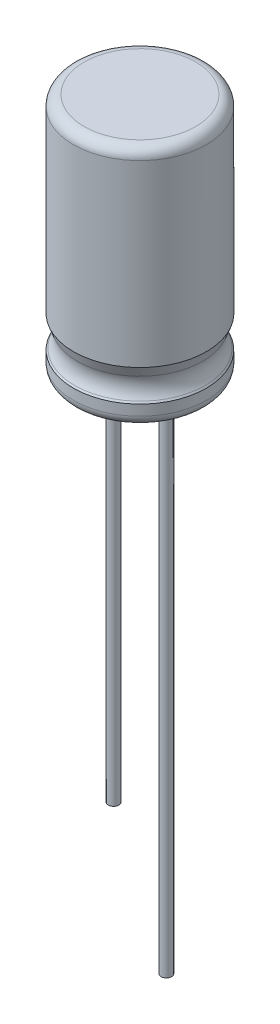
ISO-10303-21;
HEADER;
FILE_DESCRIPTION(('STEP AP214'),'2;1');
FILE_NAME('part.step','',(''),(''),'','','');
FILE_SCHEMA(('AUTOMOTIVE_DESIGN { 1 0 10303 214 1 1 1 1 }'));
ENDSEC;
DATA;
#1=APPLICATION_CONTEXT('core data for automotive mechanical design processes');
#2=APPLICATION_PROTOCOL_DEFINITION('international standard','automotive_design',2000,#1);
#3=PRODUCT_CONTEXT('',#1,'mechanical');
#4=PRODUCT('Part','Part','',(#3));
#5=PRODUCT_RELATED_PRODUCT_CATEGORY('part','',(#4));
#6=PRODUCT_DEFINITION_FORMATION('','',#4);
#7=PRODUCT_DEFINITION_CONTEXT('part definition',#1,'design');
#8=PRODUCT_DEFINITION('design','',#6,#7);
#9=PRODUCT_DEFINITION_SHAPE('','',#8);
#10=(LENGTH_UNIT() NAMED_UNIT(*) SI_UNIT(.MILLI.,.METRE.));
#11=(NAMED_UNIT(*) PLANE_ANGLE_UNIT() SI_UNIT($,.RADIAN.));
#12=(NAMED_UNIT(*) SI_UNIT($,.STERADIAN.) SOLID_ANGLE_UNIT());
#13=UNCERTAINTY_MEASURE_WITH_UNIT(LENGTH_MEASURE(1.E-05),#10,'distance_accuracy_value','');
#14=(GEOMETRIC_REPRESENTATION_CONTEXT(3) GLOBAL_UNCERTAINTY_ASSIGNED_CONTEXT((#13)) GLOBAL_UNIT_ASSIGNED_CONTEXT((#10,
#11,#12)) REPRESENTATION_CONTEXT('',''));
#15=CARTESIAN_POINT('',(0.,0.,0.));
#16=DIRECTION('',(0.,0.,1.));
#17=DIRECTION('',(1.,0.,0.));
#18=AXIS2_PLACEMENT_3D('',#15,#16,#17);
#19=CARTESIAN_POINT('',(-1.25,0.,0.));
#20=DIRECTION('',(0.,-1.,0.));
#21=DIRECTION('',(0.,0.,-1.));
#22=AXIS2_PLACEMENT_3D('',#19,#20,#21);
#23=CYLINDRICAL_SURFACE('',#22,0.25);
#24=CARTESIAN_POINT('',(-1.25,0.,0.));
#25=DIRECTION('',(0.,1.,0.));
#26=DIRECTION('',(0.,0.,1.));
#27=AXIS2_PLACEMENT_3D('',#24,#25,#26);
#28=CIRCLE('',#27,0.25);
#29=CARTESIAN_POINT('',(-1.25,0.,0.25));
#30=VERTEX_POINT('',#29);
#31=EDGE_CURVE('E55',#30,#30,#28,.T.);
#32=ORIENTED_EDGE('',*,*,#31,.F.);
#33=EDGE_LOOP('',(#32));
#34=FACE_BOUND('',#33,.T.);
#35=CARTESIAN_POINT('',(-1.25,-18.2,0.));
#36=DIRECTION('',(0.,1.,0.));
#37=DIRECTION('',(0.,0.,1.));
#38=AXIS2_PLACEMENT_3D('',#35,#36,#37);
#39=CIRCLE('',#38,0.25);
#40=CARTESIAN_POINT('',(-1.25,-18.2,0.25));
#41=VERTEX_POINT('',#40);
#42=EDGE_CURVE('E11',#41,#41,#39,.T.);
#43=ORIENTED_EDGE('',*,*,#42,.T.);
#44=EDGE_LOOP('',(#43));
#45=FACE_BOUND('',#44,.T.);
#46=ADVANCED_FACE('F49',(#34,#45),#23,.T.);
#47=CARTESIAN_POINT('',(-1.25,0.,0.));
#48=DIRECTION('',(0.,1.,0.));
#49=DIRECTION('',(0.,0.,1.));
#50=AXIS2_PLACEMENT_3D('',#47,#48,#49);
#51=PLANE('',#50);
#52=ORIENTED_EDGE('',*,*,#31,.T.);
#53=EDGE_LOOP('',(#52));
#54=FACE_BOUND('',#53,.T.);
#55=ADVANCED_FACE('F61',(#54),#51,.T.);
#56=CARTESIAN_POINT('',(-1.5,-18.2,5.));
#57=DIRECTION('',(0.,1.,0.));
#58=DIRECTION('',(0.,0.,1.));
#59=AXIS2_PLACEMENT_3D('',#56,#57,#58);
#60=PLANE('',#59);
#61=ORIENTED_EDGE('',*,*,#42,.F.);
#62=EDGE_LOOP('',(#61));
#63=FACE_BOUND('',#62,.T.);
#64=ADVANCED_FACE('F67',(#63),#60,.F.);
#65=CLOSED_SHELL('',(#46,#55,#64));
#66=MANIFOLD_SOLID_BREP('B2',#65);
#67=CARTESIAN_POINT('',(1.25,0.,0.));
#68=DIRECTION('',(0.,-1.,0.));
#69=DIRECTION('',(0.,0.,-1.));
#70=AXIS2_PLACEMENT_3D('',#67,#68,#69);
#71=CYLINDRICAL_SURFACE('',#70,0.25);
#72=CARTESIAN_POINT('',(1.25,0.,0.));
#73=DIRECTION('',(0.,1.,0.));
#74=DIRECTION('',(0.,0.,1.));
#75=AXIS2_PLACEMENT_3D('',#72,#73,#74);
#76=CIRCLE('',#75,0.25);
#77=CARTESIAN_POINT('',(1.25,0.,0.25));
#78=VERTEX_POINT('',#77);
#79=EDGE_CURVE('E48',#78,#78,#76,.T.);
#80=ORIENTED_EDGE('',*,*,#79,.F.);
#81=EDGE_LOOP('',(#80));
#82=FACE_BOUND('',#81,.T.);
#83=CARTESIAN_POINT('',(1.25,-24.,0.));
#84=DIRECTION('',(0.,1.,0.));
#85=DIRECTION('',(0.,0.,1.));
#86=AXIS2_PLACEMENT_3D('',#83,#84,#85);
#87=CIRCLE('',#86,0.25);
#88=CARTESIAN_POINT('',(1.25,-24.,0.25));
#89=VERTEX_POINT('',#88);
#90=EDGE_CURVE('E103',#89,#89,#87,.T.);
#91=ORIENTED_EDGE('',*,*,#90,.T.);
#92=EDGE_LOOP('',(#91));
#93=FACE_BOUND('',#92,.T.);
#94=ADVANCED_FACE('F100',(#82,#93),#71,.T.);
#95=CARTESIAN_POINT('',(1.25,0.,0.));
#96=DIRECTION('',(0.,1.,0.));
#97=DIRECTION('',(0.,0.,1.));
#98=AXIS2_PLACEMENT_3D('',#95,#96,#97);
#99=PLANE('',#98);
#100=ORIENTED_EDGE('',*,*,#79,.T.);
#101=EDGE_LOOP('',(#100));
#102=FACE_BOUND('',#101,.T.);
#103=ADVANCED_FACE('F115',(#102),#99,.T.);
#104=CARTESIAN_POINT('',(1.25,-24.,0.));
#105=DIRECTION('',(0.,1.,0.));
#106=DIRECTION('',(0.,0.,1.));
#107=AXIS2_PLACEMENT_3D('',#104,#105,#106);
#108=PLANE('',#107);
#109=ORIENTED_EDGE('',*,*,#90,.F.);
#110=EDGE_LOOP('',(#109));
#111=FACE_BOUND('',#110,.T.);
#112=ADVANCED_FACE('F113',(#111),#108,.F.);
#113=CLOSED_SHELL('',(#94,#103,#112));
#114=MANIFOLD_SOLID_BREP('B6',#113);
#115=CARTESIAN_POINT('',(0.,-0.2,-0.3));
#116=DIRECTION('',(0.,0.,1.));
#117=DIRECTION('',(1.,0.,0.));
#118=AXIS2_PLACEMENT_3D('',#115,#116,#117);
#119=PLANE('',#118);
#120=DIRECTION('',(1.,0.,0.));
#121=VECTOR('',#120,1.);
#122=CARTESIAN_POINT('',(0.,0.,-0.3));
#123=LINE('',#122,#121);
#124=CARTESIAN_POINT('',(-0.85,0.,-0.3));
#125=VERTEX_POINT('',#124);
#126=CARTESIAN_POINT('',(0.85,0.,-0.3));
#127=VERTEX_POINT('',#126);
#128=EDGE_CURVE('E213',#125,#127,#123,.T.);
#129=ORIENTED_EDGE('',*,*,#128,.F.);
#130=DIRECTION('',(0.,1.,0.));
#131=VECTOR('',#130,1.);
#132=CARTESIAN_POINT('',(-0.85,-0.2,-0.3));
#133=LINE('',#132,#131);
#134=CARTESIAN_POINT('',(-0.85,-0.2,-0.3));
#135=VERTEX_POINT('',#134);
#136=EDGE_CURVE('E98',#135,#125,#133,.T.);
#137=ORIENTED_EDGE('',*,*,#136,.F.);
#138=DIRECTION('',(1.,0.,0.));
#139=VECTOR('',#138,1.);
#140=CARTESIAN_POINT('',(0.,-0.2,-0.3));
#141=LINE('',#140,#139);
#142=CARTESIAN_POINT('',(0.85,-0.2,-0.3));
#143=VERTEX_POINT('',#142);
#144=EDGE_CURVE('E198',#135,#143,#141,.T.);
#145=ORIENTED_EDGE('',*,*,#144,.T.);
#146=DIRECTION('',(0.,1.,0.));
#147=VECTOR('',#146,1.);
#148=CARTESIAN_POINT('',(0.85,-0.2,-0.3));
#149=LINE('',#148,#147);
#150=EDGE_CURVE('E166',#143,#127,#149,.T.);
#151=ORIENTED_EDGE('',*,*,#150,.T.);
#152=EDGE_LOOP('',(#129,#137,#145,#151));
#153=FACE_BOUND('',#152,.T.);
#154=ADVANCED_FACE('F150',(#153),#119,.T.);
#155=CARTESIAN_POINT('',(-1.25,-0.2,0.));
#156=DIRECTION('',(0.,1.,0.));
#157=DIRECTION('',(0.,0.,1.));
#158=AXIS2_PLACEMENT_3D('',#155,#156,#157);
#159=CYLINDRICAL_SURFACE('',#158,0.5);
#160=CARTESIAN_POINT('',(-1.25,0.,0.));
#161=DIRECTION('',(0.,-1.,0.));
#162=DIRECTION('',(0.,0.,-1.));
#163=AXIS2_PLACEMENT_3D('',#160,#161,#162);
#164=CIRCLE('',#163,0.5);
#165=CARTESIAN_POINT('',(-1.75,0.,0.));
#166=VERTEX_POINT('',#165);
#167=EDGE_CURVE('E204',#125,#166,#164,.F.);
#168=ORIENTED_EDGE('',*,*,#167,.T.);
#169=DIRECTION('',(0.,1.,0.));
#170=VECTOR('',#169,1.);
#171=CARTESIAN_POINT('',(-1.75,-0.2,0.));
#172=LINE('',#171,#170);
#173=CARTESIAN_POINT('',(-1.75,-0.2,0.));
#174=VERTEX_POINT('',#173);
#175=EDGE_CURVE('E158',#174,#166,#172,.T.);
#176=ORIENTED_EDGE('',*,*,#175,.F.);
#177=CARTESIAN_POINT('',(-1.25,-0.2,0.));
#178=DIRECTION('',(0.,-1.,0.));
#179=DIRECTION('',(0.,0.,-1.));
#180=AXIS2_PLACEMENT_3D('',#177,#178,#179);
#181=CIRCLE('',#180,0.5);
#182=EDGE_CURVE('E192',#135,#174,#181,.F.);
#183=ORIENTED_EDGE('',*,*,#182,.F.);
#184=ORIENTED_EDGE('',*,*,#136,.T.);
#185=EDGE_LOOP('',(#168,#176,#183,#184));
#186=FACE_BOUND('',#185,.T.);
#187=ADVANCED_FACE('F202',(#186),#159,.F.);
#188=CARTESIAN_POINT('',(0.,-0.2,0.));
#189=DIRECTION('',(0.,1.,0.));
#190=DIRECTION('',(0.,0.,1.));
#191=AXIS2_PLACEMENT_3D('',#188,#189,#190);
#192=CYLINDRICAL_SURFACE('',#191,1.75);
#193=CARTESIAN_POINT('',(0.,0.,0.));
#194=DIRECTION('',(0.,-1.,0.));
#195=DIRECTION('',(0.,0.,-1.));
#196=AXIS2_PLACEMENT_3D('',#193,#194,#195);
#197=CIRCLE('',#196,1.75);
#198=CARTESIAN_POINT('',(1.75,0.,0.));
#199=VERTEX_POINT('',#198);
#200=EDGE_CURVE('E216',#166,#199,#197,.T.);
#201=ORIENTED_EDGE('',*,*,#200,.T.);
#202=DIRECTION('',(0.,1.,0.));
#203=VECTOR('',#202,1.);
#204=CARTESIAN_POINT('',(1.75,-0.2,0.));
#205=LINE('',#204,#203);
#206=CARTESIAN_POINT('',(1.75,-0.2,0.));
#207=VERTEX_POINT('',#206);
#208=EDGE_CURVE('E180',#207,#199,#205,.T.);
#209=ORIENTED_EDGE('',*,*,#208,.F.);
#210=CARTESIAN_POINT('',(0.,-0.2,0.));
#211=DIRECTION('',(0.,-1.,0.));
#212=DIRECTION('',(0.,0.,-1.));
#213=AXIS2_PLACEMENT_3D('',#210,#211,#212);
#214=CIRCLE('',#213,1.75);
#215=EDGE_CURVE('E197',#174,#207,#214,.T.);
#216=ORIENTED_EDGE('',*,*,#215,.F.);
#217=ORIENTED_EDGE('',*,*,#175,.T.);
#218=EDGE_LOOP('',(#201,#209,#216,#217));
#219=FACE_BOUND('',#218,.T.);
#220=ADVANCED_FACE('F207',(#219),#192,.T.);
#221=CARTESIAN_POINT('',(1.25,-0.2,0.));
#222=DIRECTION('',(0.,1.,0.));
#223=DIRECTION('',(0.,0.,1.));
#224=AXIS2_PLACEMENT_3D('',#221,#222,#223);
#225=CYLINDRICAL_SURFACE('',#224,0.5);
#226=CARTESIAN_POINT('',(1.25,0.,0.));
#227=DIRECTION('',(0.,-1.,0.));
#228=DIRECTION('',(0.,0.,-1.));
#229=AXIS2_PLACEMENT_3D('',#226,#227,#228);
#230=CIRCLE('',#229,0.5);
#231=EDGE_CURVE('E218',#127,#199,#230,.T.);
#232=ORIENTED_EDGE('',*,*,#231,.F.);
#233=ORIENTED_EDGE('',*,*,#150,.F.);
#234=CARTESIAN_POINT('',(1.25,-0.2,0.));
#235=DIRECTION('',(0.,-1.,0.));
#236=DIRECTION('',(0.,0.,-1.));
#237=AXIS2_PLACEMENT_3D('',#234,#235,#236);
#238=CIRCLE('',#237,0.5);
#239=EDGE_CURVE('E208',#143,#207,#238,.T.);
#240=ORIENTED_EDGE('',*,*,#239,.T.);
#241=ORIENTED_EDGE('',*,*,#208,.T.);
#242=EDGE_LOOP('',(#232,#233,#240,#241));
#243=FACE_BOUND('',#242,.T.);
#244=ADVANCED_FACE('F223',(#243),#225,.F.);
#245=CARTESIAN_POINT('',(0.,-0.2,0.));
#246=DIRECTION('',(0.,-1.,0.));
#247=DIRECTION('',(0.,0.,-1.));
#248=AXIS2_PLACEMENT_3D('',#245,#246,#247);
#249=PLANE('',#248);
#250=ORIENTED_EDGE('',*,*,#144,.F.);
#251=ORIENTED_EDGE('',*,*,#182,.T.);
#252=ORIENTED_EDGE('',*,*,#215,.T.);
#253=ORIENTED_EDGE('',*,*,#239,.F.);
#254=EDGE_LOOP('',(#250,#251,#252,#253));
#255=FACE_BOUND('',#254,.T.);
#256=ADVANCED_FACE('F194',(#255),#249,.T.);
#257=CARTESIAN_POINT('',(0.,0.,0.));
#258=DIRECTION('',(0.,-1.,0.));
#259=DIRECTION('',(0.,0.,-1.));
#260=AXIS2_PLACEMENT_3D('',#257,#258,#259);
#261=PLANE('',#260);
#262=ORIENTED_EDGE('',*,*,#128,.T.);
#263=ORIENTED_EDGE('',*,*,#231,.T.);
#264=ORIENTED_EDGE('',*,*,#200,.F.);
#265=ORIENTED_EDGE('',*,*,#167,.F.);
#266=EDGE_LOOP('',(#262,#263,#264,#265));
#267=FACE_BOUND('',#266,.T.);
#268=ADVANCED_FACE('F230',(#267),#261,.F.);
#269=CLOSED_SHELL('',(#154,#187,#220,#244,#256,#268));
#270=MANIFOLD_SOLID_BREP('B43',#269);
#271=CARTESIAN_POINT('',(0.,-0.2,0.));
#272=DIRECTION('',(0.,1.,0.));
#273=DIRECTION('',(0.,0.,1.));
#274=AXIS2_PLACEMENT_3D('',#271,#272,#273);
#275=CYLINDRICAL_SURFACE('',#274,1.75);
#276=CARTESIAN_POINT('',(0.,0.,0.));
#277=DIRECTION('',(0.,-1.,0.));
#278=DIRECTION('',(0.,0.,-1.));
#279=AXIS2_PLACEMENT_3D('',#276,#277,#278);
#280=CIRCLE('',#279,1.75);
#281=CARTESIAN_POINT('',(1.75,0.,0.));
#282=VERTEX_POINT('',#281);
#283=CARTESIAN_POINT('',(-1.75,0.,0.));
#284=VERTEX_POINT('',#283);
#285=EDGE_CURVE('E343',#282,#284,#280,.T.);
#286=ORIENTED_EDGE('',*,*,#285,.T.);
#287=DIRECTION('',(0.,1.,0.));
#288=VECTOR('',#287,1.);
#289=CARTESIAN_POINT('',(-1.75,-0.2,0.));
#290=LINE('',#289,#288);
#291=CARTESIAN_POINT('',(-1.75,-0.2,0.));
#292=VERTEX_POINT('',#291);
#293=EDGE_CURVE('E148',#292,#284,#290,.T.);
#294=ORIENTED_EDGE('',*,*,#293,.F.);
#295=CARTESIAN_POINT('',(0.,-0.2,0.));
#296=DIRECTION('',(0.,-1.,0.));
#297=DIRECTION('',(0.,0.,-1.));
#298=AXIS2_PLACEMENT_3D('',#295,#296,#297);
#299=CIRCLE('',#298,1.75);
#300=CARTESIAN_POINT('',(1.75,-0.2,0.));
#301=VERTEX_POINT('',#300);
#302=EDGE_CURVE('E329',#301,#292,#299,.T.);
#303=ORIENTED_EDGE('',*,*,#302,.F.);
#304=DIRECTION('',(0.,1.,0.));
#305=VECTOR('',#304,1.);
#306=CARTESIAN_POINT('',(1.75,-0.2,0.));
#307=LINE('',#306,#305);
#308=EDGE_CURVE('E296',#301,#282,#307,.T.);
#309=ORIENTED_EDGE('',*,*,#308,.T.);
#310=EDGE_LOOP('',(#286,#294,#303,#309));
#311=FACE_BOUND('',#310,.T.);
#312=ADVANCED_FACE('F280',(#311),#275,.T.);
#313=CARTESIAN_POINT('',(-1.25,-0.2,0.));
#314=DIRECTION('',(0.,1.,0.));
#315=DIRECTION('',(0.,0.,1.));
#316=AXIS2_PLACEMENT_3D('',#313,#314,#315);
#317=CYLINDRICAL_SURFACE('',#316,0.5);
#318=CARTESIAN_POINT('',(-1.25,0.,0.));
#319=DIRECTION('',(0.,-1.,0.));
#320=DIRECTION('',(0.,0.,-1.));
#321=AXIS2_PLACEMENT_3D('',#318,#319,#320);
#322=CIRCLE('',#321,0.5);
#323=CARTESIAN_POINT('',(-0.85,0.,0.3));
#324=VERTEX_POINT('',#323);
#325=EDGE_CURVE('E334',#284,#324,#322,.F.);
#326=ORIENTED_EDGE('',*,*,#325,.T.);
#327=DIRECTION('',(0.,1.,0.));
#328=VECTOR('',#327,1.);
#329=CARTESIAN_POINT('',(-0.85,-0.2,0.3));
#330=LINE('',#329,#328);
#331=CARTESIAN_POINT('',(-0.85,-0.2,0.3));
#332=VERTEX_POINT('',#331);
#333=EDGE_CURVE('E288',#332,#324,#330,.T.);
#334=ORIENTED_EDGE('',*,*,#333,.F.);
#335=CARTESIAN_POINT('',(-1.25,-0.2,0.));
#336=DIRECTION('',(0.,-1.,0.));
#337=DIRECTION('',(0.,0.,-1.));
#338=AXIS2_PLACEMENT_3D('',#335,#336,#337);
#339=CIRCLE('',#338,0.5);
#340=EDGE_CURVE('E322',#292,#332,#339,.F.);
#341=ORIENTED_EDGE('',*,*,#340,.F.);
#342=ORIENTED_EDGE('',*,*,#293,.T.);
#343=EDGE_LOOP('',(#326,#334,#341,#342));
#344=FACE_BOUND('',#343,.T.);
#345=ADVANCED_FACE('F333',(#344),#317,.F.);
#346=CARTESIAN_POINT('',(0.,-0.2,0.3));
#347=DIRECTION('',(0.,0.,1.));
#348=DIRECTION('',(1.,0.,0.));
#349=AXIS2_PLACEMENT_3D('',#346,#347,#348);
#350=PLANE('',#349);
#351=DIRECTION('',(1.,0.,0.));
#352=VECTOR('',#351,1.);
#353=CARTESIAN_POINT('',(0.,0.,0.3));
#354=LINE('',#353,#352);
#355=CARTESIAN_POINT('',(0.85,0.,0.3));
#356=VERTEX_POINT('',#355);
#357=EDGE_CURVE('E346',#324,#356,#354,.T.);
#358=ORIENTED_EDGE('',*,*,#357,.T.);
#359=DIRECTION('',(0.,1.,0.));
#360=VECTOR('',#359,1.);
#361=CARTESIAN_POINT('',(0.85,-0.2,0.3));
#362=LINE('',#361,#360);
#363=CARTESIAN_POINT('',(0.85,-0.2,0.3));
#364=VERTEX_POINT('',#363);
#365=EDGE_CURVE('E311',#364,#356,#362,.T.);
#366=ORIENTED_EDGE('',*,*,#365,.F.);
#367=DIRECTION('',(1.,0.,0.));
#368=VECTOR('',#367,1.);
#369=CARTESIAN_POINT('',(0.,-0.2,0.3));
#370=LINE('',#369,#368);
#371=EDGE_CURVE('E328',#332,#364,#370,.T.);
#372=ORIENTED_EDGE('',*,*,#371,.F.);
#373=ORIENTED_EDGE('',*,*,#333,.T.);
#374=EDGE_LOOP('',(#358,#366,#372,#373));
#375=FACE_BOUND('',#374,.T.);
#376=ADVANCED_FACE('F337',(#375),#350,.F.);
#377=CARTESIAN_POINT('',(1.25,-0.2,0.));
#378=DIRECTION('',(0.,1.,0.));
#379=DIRECTION('',(0.,0.,1.));
#380=AXIS2_PLACEMENT_3D('',#377,#378,#379);
#381=CYLINDRICAL_SURFACE('',#380,0.5);
#382=CARTESIAN_POINT('',(1.25,0.,0.));
#383=DIRECTION('',(0.,-1.,0.));
#384=DIRECTION('',(0.,0.,-1.));
#385=AXIS2_PLACEMENT_3D('',#382,#383,#384);
#386=CIRCLE('',#385,0.5);
#387=EDGE_CURVE('E348',#282,#356,#386,.T.);
#388=ORIENTED_EDGE('',*,*,#387,.F.);
#389=ORIENTED_EDGE('',*,*,#308,.F.);
#390=CARTESIAN_POINT('',(1.25,-0.2,0.));
#391=DIRECTION('',(0.,-1.,0.));
#392=DIRECTION('',(0.,0.,-1.));
#393=AXIS2_PLACEMENT_3D('',#390,#391,#392);
#394=CIRCLE('',#393,0.5);
#395=EDGE_CURVE('E338',#301,#364,#394,.T.);
#396=ORIENTED_EDGE('',*,*,#395,.T.);
#397=ORIENTED_EDGE('',*,*,#365,.T.);
#398=EDGE_LOOP('',(#388,#389,#396,#397));
#399=FACE_BOUND('',#398,.T.);
#400=ADVANCED_FACE('F354',(#399),#381,.F.);
#401=CARTESIAN_POINT('',(0.,-0.2,0.));
#402=DIRECTION('',(0.,-1.,0.));
#403=DIRECTION('',(0.,0.,-1.));
#404=AXIS2_PLACEMENT_3D('',#401,#402,#403);
#405=PLANE('',#404);
#406=ORIENTED_EDGE('',*,*,#302,.T.);
#407=ORIENTED_EDGE('',*,*,#340,.T.);
#408=ORIENTED_EDGE('',*,*,#371,.T.);
#409=ORIENTED_EDGE('',*,*,#395,.F.);
#410=EDGE_LOOP('',(#406,#407,#408,#409));
#411=FACE_BOUND('',#410,.T.);
#412=ADVANCED_FACE('F325',(#411),#405,.T.);
#413=CARTESIAN_POINT('',(0.,0.,0.));
#414=DIRECTION('',(0.,-1.,0.));
#415=DIRECTION('',(0.,0.,-1.));
#416=AXIS2_PLACEMENT_3D('',#413,#414,#415);
#417=PLANE('',#416);
#418=ORIENTED_EDGE('',*,*,#285,.F.);
#419=ORIENTED_EDGE('',*,*,#387,.T.);
#420=ORIENTED_EDGE('',*,*,#357,.F.);
#421=ORIENTED_EDGE('',*,*,#325,.F.);
#422=EDGE_LOOP('',(#418,#419,#420,#421));
#423=FACE_BOUND('',#422,.T.);
#424=ADVANCED_FACE('F353',(#423),#417,.F.);
#425=CLOSED_SHELL('',(#312,#345,#376,#400,#412,#424));
#426=MANIFOLD_SOLID_BREP('B92',#425);
#427=CARTESIAN_POINT('',(0.,0.,0.));
#428=DIRECTION('',(0.,1.,0.));
#429=DIRECTION('',(0.,0.,1.));
#430=AXIS2_PLACEMENT_3D('',#427,#428,#429);
#431=PLANE('',#430);
#432=CARTESIAN_POINT('',(0.,0.,0.));
#433=DIRECTION('',(0.,1.,0.));
#434=DIRECTION('',(0.,0.,1.));
#435=AXIS2_PLACEMENT_3D('',#432,#433,#434);
#436=CIRCLE('',#435,2.65);
#437=CARTESIAN_POINT('',(0.,0.,2.65));
#438=VERTEX_POINT('',#437);
#439=EDGE_CURVE('E279',#438,#438,#436,.F.);
#440=ORIENTED_EDGE('',*,*,#439,.T.);
#441=EDGE_LOOP('',(#440));
#442=FACE_BOUND('',#441,.T.);
#443=ADVANCED_FACE('F404',(#442),#431,.F.);
#444=CARTESIAN_POINT('',(0.,11.5,0.));
#445=DIRECTION('',(0.,1.,0.));
#446=DIRECTION('',(0.,0.,1.));
#447=AXIS2_PLACEMENT_3D('',#444,#445,#446);
#448=CYLINDRICAL_SURFACE('',#447,3.15);
#449=CARTESIAN_POINT('',(0.,0.5,0.));
#450=DIRECTION('',(0.,1.,0.));
#451=DIRECTION('',(0.,0.,1.));
#452=AXIS2_PLACEMENT_3D('',#449,#450,#451);
#453=CIRCLE('',#452,3.15);
#454=CARTESIAN_POINT('',(0.,0.5,3.15));
#455=VERTEX_POINT('',#454);
#456=EDGE_CURVE('E411',#455,#455,#453,.T.);
#457=ORIENTED_EDGE('',*,*,#456,.T.);
#458=EDGE_LOOP('',(#457));
#459=FACE_BOUND('',#458,.T.);
#460=CARTESIAN_POINT('',(0.,1.,0.));
#461=DIRECTION('',(0.,1.,0.));
#462=DIRECTION('',(0.,0.,1.));
#463=AXIS2_PLACEMENT_3D('',#460,#461,#462);
#464=CIRCLE('',#463,3.15);
#465=CARTESIAN_POINT('',(0.,1.,3.15));
#466=VERTEX_POINT('',#465);
#467=EDGE_CURVE('E430',#466,#466,#464,.T.);
#468=ORIENTED_EDGE('',*,*,#467,.F.);
#469=EDGE_LOOP('',(#468));
#470=FACE_BOUND('',#469,.T.);
#471=ADVANCED_FACE('F451',(#459,#470),#448,.T.);
#472=CARTESIAN_POINT('',(0.,1.,0.));
#473=DIRECTION('',(0.,-1.,0.));
#474=DIRECTION('',(0.,0.,-1.));
#475=AXIS2_PLACEMENT_3D('',#472,#473,#474);
#476=CONICAL_SURFACE('',#475,3.15,0.621705865158935);
#477=CARTESIAN_POINT('',(0.,1.08077726116778,0.));
#478=DIRECTION('',(0.,-1.,0.));
#479=DIRECTION('',(0.,0.,-1.));
#480=AXIS2_PLACEMENT_3D('',#477,#478,#479);
#481=CIRCLE('',#480,3.09212410725836);
#482=CARTESIAN_POINT('',(0.,1.08077726116778,-3.09212410725836));
#483=VERTEX_POINT('',#482);
#484=EDGE_CURVE('E424',#483,#483,#481,.T.);
#485=ORIENTED_EDGE('',*,*,#484,.T.);
#486=EDGE_LOOP('',(#485));
#487=FACE_BOUND('',#486,.T.);
#488=ORIENTED_EDGE('',*,*,#467,.T.);
#489=EDGE_LOOP('',(#488));
#490=FACE_BOUND('',#489,.T.);
#491=ADVANCED_FACE('F441',(#487,#490),#476,.T.);
#492=CARTESIAN_POINT('',(0.,1.51384751335021,0.));
#493=DIRECTION('',(0.,1.,0.));
#494=DIRECTION('',(0.,0.,1.));
#495=AXIS2_PLACEMENT_3D('',#492,#493,#494);
#496=CONICAL_SURFACE('',#495,2.78183471266194,0.357310189167626);
#497=CARTESIAN_POINT('',(0.,2.01295551906618,0.));
#498=DIRECTION('',(0.,1.,0.));
#499=DIRECTION('',(0.,0.,1.));
#500=AXIS2_PLACEMENT_3D('',#497,#498,#499);
#501=CIRCLE('',#500,2.96816922464133);
#502=CARTESIAN_POINT('',(0.,2.01295551906618,2.96816922464133));
#503=VERTEX_POINT('',#502);
#504=EDGE_CURVE('E427',#503,#503,#501,.T.);
#505=ORIENTED_EDGE('',*,*,#504,.T.);
#506=EDGE_LOOP('',(#505));
#507=FACE_BOUND('',#506,.T.);
#508=CARTESIAN_POINT('',(0.,2.5,0.));
#509=DIRECTION('',(0.,1.,0.));
#510=DIRECTION('',(0.,0.,1.));
#511=AXIS2_PLACEMENT_3D('',#508,#509,#510);
#512=CIRCLE('',#511,3.15);
#513=CARTESIAN_POINT('',(0.,2.5,3.15));
#514=VERTEX_POINT('',#513);
#515=EDGE_CURVE('E433',#514,#514,#512,.T.);
#516=ORIENTED_EDGE('',*,*,#515,.F.);
#517=EDGE_LOOP('',(#516));
#518=FACE_BOUND('',#517,.T.);
#519=ADVANCED_FACE('F439',(#507,#518),#496,.T.);
#520=CARTESIAN_POINT('',(0.,11.5,0.));
#521=DIRECTION('',(0.,1.,0.));
#522=DIRECTION('',(0.,0.,1.));
#523=AXIS2_PLACEMENT_3D('',#520,#521,#522);
#524=CYLINDRICAL_SURFACE('',#523,3.15);
#525=CARTESIAN_POINT('',(0.,11.,0.));
#526=DIRECTION('',(0.,-1.,0.));
#527=DIRECTION('',(0.,0.,-1.));
#528=AXIS2_PLACEMENT_3D('',#525,#526,#527);
#529=CIRCLE('',#528,3.15);
#530=CARTESIAN_POINT('',(0.,11.,-3.15));
#531=VERTEX_POINT('',#530);
#532=EDGE_CURVE('E415',#531,#531,#529,.T.);
#533=ORIENTED_EDGE('',*,*,#532,.T.);
#534=EDGE_LOOP('',(#533));
#535=FACE_BOUND('',#534,.T.);
#536=ORIENTED_EDGE('',*,*,#515,.T.);
#537=EDGE_LOOP('',(#536));
#538=FACE_BOUND('',#537,.T.);
#539=ADVANCED_FACE('F437',(#535,#538),#524,.T.);
#540=CARTESIAN_POINT('',(3.15,11.5,0.));
#541=DIRECTION('',(0.,-1.,0.));
#542=DIRECTION('',(0.,0.,-1.));
#543=AXIS2_PLACEMENT_3D('',#540,#541,#542);
#544=PLANE('',#543);
#545=CARTESIAN_POINT('',(0.,11.5,0.));
#546=DIRECTION('',(0.,-1.,0.));
#547=DIRECTION('',(0.,0.,-1.));
#548=AXIS2_PLACEMENT_3D('',#545,#546,#547);
#549=CIRCLE('',#548,2.65);
#550=CARTESIAN_POINT('',(0.,11.5,-2.65));
#551=VERTEX_POINT('',#550);
#552=EDGE_CURVE('E419',#551,#551,#549,.F.);
#553=ORIENTED_EDGE('',*,*,#552,.T.);
#554=EDGE_LOOP('',(#553));
#555=FACE_BOUND('',#554,.T.);
#556=ADVANCED_FACE('F448',(#555),#544,.F.);
#557=CARTESIAN_POINT('',(0.,1.66319994253559,0.));
#558=DIRECTION('',(0.,1.,0.));
#559=DIRECTION('',(0.,0.,1.));
#560=AXIS2_PLACEMENT_3D('',#557,#558,#559);
#561=TOROIDAL_SURFACE('',#560,3.90501021258205,1.);
#562=ORIENTED_EDGE('',*,*,#484,.F.);
#563=EDGE_LOOP('',(#562));
#564=FACE_BOUND('',#563,.T.);
#565=ORIENTED_EDGE('',*,*,#504,.F.);
#566=EDGE_LOOP('',(#565));
#567=FACE_BOUND('',#566,.T.);
#568=ADVANCED_FACE('F461',(#564,#567),#561,.F.);
#569=CARTESIAN_POINT('',(0.,11.,0.));
#570=DIRECTION('',(0.,-1.,0.));
#571=DIRECTION('',(0.,0.,-1.));
#572=AXIS2_PLACEMENT_3D('',#569,#570,#571);
#573=TOROIDAL_SURFACE('',#572,2.65,0.5);
#574=ORIENTED_EDGE('',*,*,#532,.F.);
#575=EDGE_LOOP('',(#574));
#576=FACE_BOUND('',#575,.T.);
#577=ORIENTED_EDGE('',*,*,#552,.F.);
#578=EDGE_LOOP('',(#577));
#579=FACE_BOUND('',#578,.T.);
#580=ADVANCED_FACE('F463',(#576,#579),#573,.T.);
#581=CARTESIAN_POINT('',(0.,0.5,0.));
#582=DIRECTION('',(0.,1.,0.));
#583=DIRECTION('',(0.,0.,1.));
#584=AXIS2_PLACEMENT_3D('',#581,#582,#583);
#585=TOROIDAL_SURFACE('',#584,2.65,0.5);
#586=ORIENTED_EDGE('',*,*,#439,.F.);
#587=EDGE_LOOP('',(#586));
#588=FACE_BOUND('',#587,.T.);
#589=ORIENTED_EDGE('',*,*,#456,.F.);
#590=EDGE_LOOP('',(#589));
#591=FACE_BOUND('',#590,.T.);
#592=ADVANCED_FACE('F406',(#588,#591),#585,.T.);
#593=CLOSED_SHELL('',(#443,#471,#491,#519,#539,#556,#568,#580,#592));
#594=MANIFOLD_SOLID_BREP('B142',#593);
#595=ADVANCED_BREP_SHAPE_REPRESENTATION('',(#18,#66,#114,#270,#426,#594),#14);
#596=SHAPE_DEFINITION_REPRESENTATION(#9,#595);
ENDSEC;
END-ISO-10303-21;
